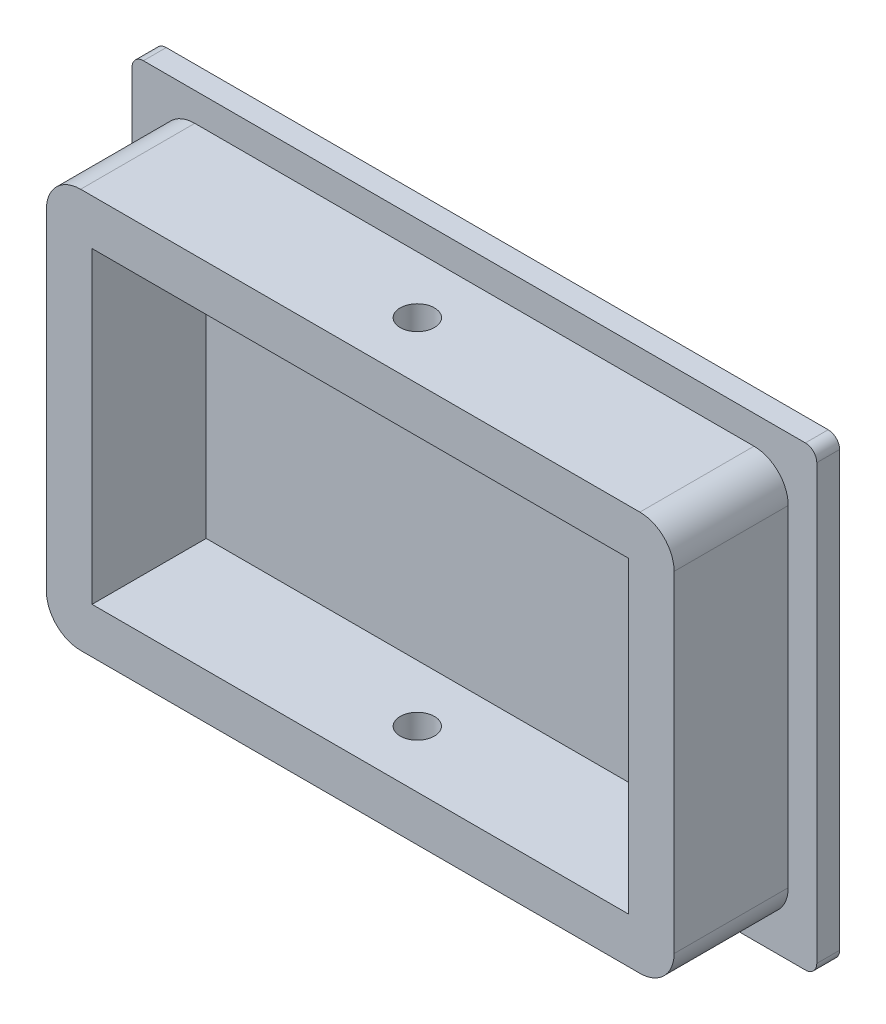
ISO-10303-21;
HEADER;
FILE_DESCRIPTION(('STEP AP214'),'2;1');
FILE_NAME('part.step','',(''),(''),'','','');
FILE_SCHEMA(('AUTOMOTIVE_DESIGN { 1 0 10303 214 1 1 1 1 }'));
ENDSEC;
DATA;
#1=APPLICATION_CONTEXT('core data for automotive mechanical design processes');
#2=APPLICATION_PROTOCOL_DEFINITION('international standard','automotive_design',2000,#1);
#3=PRODUCT_CONTEXT('',#1,'mechanical');
#4=PRODUCT('Part','Part','',(#3));
#5=PRODUCT_RELATED_PRODUCT_CATEGORY('part','',(#4));
#6=PRODUCT_DEFINITION_FORMATION('','',#4);
#7=PRODUCT_DEFINITION_CONTEXT('part definition',#1,'design');
#8=PRODUCT_DEFINITION('design','',#6,#7);
#9=PRODUCT_DEFINITION_SHAPE('','',#8);
#10=(LENGTH_UNIT() NAMED_UNIT(*) SI_UNIT(.MILLI.,.METRE.));
#11=(NAMED_UNIT(*) PLANE_ANGLE_UNIT() SI_UNIT($,.RADIAN.));
#12=(NAMED_UNIT(*) SI_UNIT($,.STERADIAN.) SOLID_ANGLE_UNIT());
#13=UNCERTAINTY_MEASURE_WITH_UNIT(LENGTH_MEASURE(1.E-05),#10,'distance_accuracy_value','');
#14=(GEOMETRIC_REPRESENTATION_CONTEXT(3) GLOBAL_UNCERTAINTY_ASSIGNED_CONTEXT((#13)) GLOBAL_UNIT_ASSIGNED_CONTEXT((#10,
#11,#12)) REPRESENTATION_CONTEXT('',''));
#15=CARTESIAN_POINT('',(0.,0.,0.));
#16=DIRECTION('',(0.,0.,1.));
#17=DIRECTION('',(1.,0.,0.));
#18=AXIS2_PLACEMENT_3D('',#15,#16,#17);
#19=CARTESIAN_POINT('',(0.,0.,2.));
#20=DIRECTION('',(0.,0.,-1.));
#21=DIRECTION('',(-1.,0.,0.));
#22=AXIS2_PLACEMENT_3D('',#19,#20,#21);
#23=PLANE('',#22);
#24=DIRECTION('',(0.,-1.,0.));
#25=VECTOR('',#24,1.);
#26=CARTESIAN_POINT('',(0.,0.,2.));
#27=LINE('',#26,#25);
#28=CARTESIAN_POINT('',(0.,39.,2.));
#29=VERTEX_POINT('',#28);
#30=CARTESIAN_POINT('',(0.,1.,2.));
#31=VERTEX_POINT('',#30);
#32=EDGE_CURVE('E259',#29,#31,#27,.T.);
#33=ORIENTED_EDGE('',*,*,#32,.T.);
#34=CARTESIAN_POINT('',(1.,1.,2.));
#35=DIRECTION('',(0.,0.,-1.));
#36=DIRECTION('',(-1.,0.,0.));
#37=AXIS2_PLACEMENT_3D('',#34,#35,#36);
#38=CIRCLE('',#37,1.);
#39=CARTESIAN_POINT('',(1.,0.,2.));
#40=VERTEX_POINT('',#39);
#41=EDGE_CURVE('E375',#31,#40,#38,.F.);
#42=ORIENTED_EDGE('',*,*,#41,.T.);
#43=DIRECTION('',(1.,0.,0.));
#44=VECTOR('',#43,1.);
#45=CARTESIAN_POINT('',(0.,0.,2.));
#46=LINE('',#45,#44);
#47=CARTESIAN_POINT('',(59.,0.,2.));
#48=VERTEX_POINT('',#47);
#49=EDGE_CURVE('E263',#40,#48,#46,.T.);
#50=ORIENTED_EDGE('',*,*,#49,.T.);
#51=CARTESIAN_POINT('',(59.,1.,2.));
#52=DIRECTION('',(0.,0.,-1.));
#53=DIRECTION('',(-1.,0.,0.));
#54=AXIS2_PLACEMENT_3D('',#51,#52,#53);
#55=CIRCLE('',#54,1.);
#56=CARTESIAN_POINT('',(60.,1.,2.));
#57=VERTEX_POINT('',#56);
#58=EDGE_CURVE('E372',#48,#57,#55,.F.);
#59=ORIENTED_EDGE('',*,*,#58,.T.);
#60=DIRECTION('',(0.,1.,0.));
#61=VECTOR('',#60,1.);
#62=CARTESIAN_POINT('',(60.,0.,2.));
#63=LINE('',#62,#61);
#64=CARTESIAN_POINT('',(60.,39.,2.));
#65=VERTEX_POINT('',#64);
#66=EDGE_CURVE('E268',#57,#65,#63,.T.);
#67=ORIENTED_EDGE('',*,*,#66,.T.);
#68=CARTESIAN_POINT('',(59.,39.,2.));
#69=DIRECTION('',(0.,0.,-1.));
#70=DIRECTION('',(-1.,0.,0.));
#71=AXIS2_PLACEMENT_3D('',#68,#69,#70);
#72=CIRCLE('',#71,1.);
#73=CARTESIAN_POINT('',(59.,40.,2.));
#74=VERTEX_POINT('',#73);
#75=EDGE_CURVE('E369',#65,#74,#72,.F.);
#76=ORIENTED_EDGE('',*,*,#75,.T.);
#77=DIRECTION('',(-1.,0.,0.));
#78=VECTOR('',#77,1.);
#79=CARTESIAN_POINT('',(0.,40.,2.));
#80=LINE('',#79,#78);
#81=CARTESIAN_POINT('',(1.,40.,2.));
#82=VERTEX_POINT('',#81);
#83=EDGE_CURVE('E272',#74,#82,#80,.T.);
#84=ORIENTED_EDGE('',*,*,#83,.T.);
#85=CARTESIAN_POINT('',(1.,39.,2.));
#86=DIRECTION('',(0.,0.,-1.));
#87=DIRECTION('',(-1.,0.,0.));
#88=AXIS2_PLACEMENT_3D('',#85,#86,#87);
#89=CIRCLE('',#88,1.);
#90=EDGE_CURVE('E366',#82,#29,#89,.F.);
#91=ORIENTED_EDGE('',*,*,#90,.T.);
#92=EDGE_LOOP('',(#33,#42,#50,#59,#67,#76,#84,#91));
#93=FACE_BOUND('',#92,.T.);
#94=DIRECTION('',(-1.,0.,0.));
#95=VECTOR('',#94,1.);
#96=CARTESIAN_POINT('',(57.5,37.5,2.));
#97=LINE('',#96,#95);
#98=CARTESIAN_POINT('',(54.5,37.5,2.));
#99=VERTEX_POINT('',#98);
#100=CARTESIAN_POINT('',(5.5,37.5,2.));
#101=VERTEX_POINT('',#100);
#102=EDGE_CURVE('E226',#99,#101,#97,.T.);
#103=ORIENTED_EDGE('',*,*,#102,.F.);
#104=CARTESIAN_POINT('',(54.5,34.5,2.));
#105=DIRECTION('',(0.,0.,-1.));
#106=DIRECTION('',(-1.,0.,0.));
#107=AXIS2_PLACEMENT_3D('',#104,#105,#106);
#108=CIRCLE('',#107,3.);
#109=CARTESIAN_POINT('',(57.5,34.5,2.));
#110=VERTEX_POINT('',#109);
#111=EDGE_CURVE('E337',#99,#110,#108,.T.);
#112=ORIENTED_EDGE('',*,*,#111,.T.);
#113=DIRECTION('',(0.,1.,0.));
#114=VECTOR('',#113,1.);
#115=CARTESIAN_POINT('',(57.5,2.5,2.));
#116=LINE('',#115,#114);
#117=CARTESIAN_POINT('',(57.5,5.5,2.));
#118=VERTEX_POINT('',#117);
#119=EDGE_CURVE('E232',#118,#110,#116,.T.);
#120=ORIENTED_EDGE('',*,*,#119,.F.);
#121=CARTESIAN_POINT('',(54.5,5.5,2.));
#122=DIRECTION('',(0.,0.,-1.));
#123=DIRECTION('',(-1.,0.,0.));
#124=AXIS2_PLACEMENT_3D('',#121,#122,#123);
#125=CIRCLE('',#124,3.);
#126=CARTESIAN_POINT('',(54.5,2.5,2.));
#127=VERTEX_POINT('',#126);
#128=EDGE_CURVE('E334',#118,#127,#125,.T.);
#129=ORIENTED_EDGE('',*,*,#128,.T.);
#130=DIRECTION('',(1.,0.,0.));
#131=VECTOR('',#130,1.);
#132=CARTESIAN_POINT('',(2.5,2.5,2.));
#133=LINE('',#132,#131);
#134=CARTESIAN_POINT('',(5.5,2.5,2.));
#135=VERTEX_POINT('',#134);
#136=EDGE_CURVE('E252',#135,#127,#133,.T.);
#137=ORIENTED_EDGE('',*,*,#136,.F.);
#138=CARTESIAN_POINT('',(5.5,5.5,2.));
#139=DIRECTION('',(0.,0.,-1.));
#140=DIRECTION('',(-1.,0.,0.));
#141=AXIS2_PLACEMENT_3D('',#138,#139,#140);
#142=CIRCLE('',#141,3.);
#143=CARTESIAN_POINT('',(2.5,5.5,2.));
#144=VERTEX_POINT('',#143);
#145=EDGE_CURVE('E331',#135,#144,#142,.T.);
#146=ORIENTED_EDGE('',*,*,#145,.T.);
#147=DIRECTION('',(0.,-1.,0.));
#148=VECTOR('',#147,1.);
#149=CARTESIAN_POINT('',(2.5,37.5,2.));
#150=LINE('',#149,#148);
#151=CARTESIAN_POINT('',(2.5,34.5,2.));
#152=VERTEX_POINT('',#151);
#153=EDGE_CURVE('E248',#152,#144,#150,.T.);
#154=ORIENTED_EDGE('',*,*,#153,.F.);
#155=CARTESIAN_POINT('',(5.5,34.5,2.));
#156=DIRECTION('',(0.,0.,-1.));
#157=DIRECTION('',(-1.,0.,0.));
#158=AXIS2_PLACEMENT_3D('',#155,#156,#157);
#159=CIRCLE('',#158,3.);
#160=EDGE_CURVE('E328',#152,#101,#159,.T.);
#161=ORIENTED_EDGE('',*,*,#160,.T.);
#162=EDGE_LOOP('',(#103,#112,#120,#129,#137,#146,#154,#161));
#163=FACE_BOUND('',#162,.T.);
#164=ADVANCED_FACE('F39',(#93,#163),#23,.F.);
#165=CARTESIAN_POINT('',(0.,0.,2.));
#166=DIRECTION('',(1.,0.,0.));
#167=DIRECTION('',(0.,0.,-1.));
#168=AXIS2_PLACEMENT_3D('',#165,#166,#167);
#169=PLANE('',#168);
#170=DIRECTION('',(0.,-1.,0.));
#171=VECTOR('',#170,1.);
#172=CARTESIAN_POINT('',(0.,0.,0.));
#173=LINE('',#172,#171);
#174=CARTESIAN_POINT('',(0.,39.,0.));
#175=VERTEX_POINT('',#174);
#176=CARTESIAN_POINT('',(0.,1.,0.));
#177=VERTEX_POINT('',#176);
#178=EDGE_CURVE('E244',#175,#177,#173,.T.);
#179=ORIENTED_EDGE('',*,*,#178,.T.);
#180=DIRECTION('',(0.,0.,-1.));
#181=VECTOR('',#180,1.);
#182=CARTESIAN_POINT('',(0.,1.,2.));
#183=LINE('',#182,#181);
#184=EDGE_CURVE('E363',#177,#31,#183,.F.);
#185=ORIENTED_EDGE('',*,*,#184,.T.);
#186=ORIENTED_EDGE('',*,*,#32,.F.);
#187=DIRECTION('',(0.,0.,-1.));
#188=VECTOR('',#187,1.);
#189=CARTESIAN_POINT('',(0.,39.,2.));
#190=LINE('',#189,#188);
#191=EDGE_CURVE('E359',#29,#175,#190,.T.);
#192=ORIENTED_EDGE('',*,*,#191,.T.);
#193=EDGE_LOOP('',(#179,#185,#186,#192));
#194=FACE_BOUND('',#193,.T.);
#195=ADVANCED_FACE('F411',(#194),#169,.F.);
#196=CARTESIAN_POINT('',(0.,0.,2.));
#197=DIRECTION('',(0.,1.,0.));
#198=DIRECTION('',(0.,0.,1.));
#199=AXIS2_PLACEMENT_3D('',#196,#197,#198);
#200=PLANE('',#199);
#201=ORIENTED_EDGE('',*,*,#49,.F.);
#202=DIRECTION('',(0.,0.,-1.));
#203=VECTOR('',#202,1.);
#204=CARTESIAN_POINT('',(1.,0.,2.));
#205=LINE('',#204,#203);
#206=CARTESIAN_POINT('',(1.,0.,0.));
#207=VERTEX_POINT('',#206);
#208=EDGE_CURVE('E343',#40,#207,#205,.T.);
#209=ORIENTED_EDGE('',*,*,#208,.T.);
#210=DIRECTION('',(1.,0.,0.));
#211=VECTOR('',#210,1.);
#212=CARTESIAN_POINT('',(0.,0.,0.));
#213=LINE('',#212,#211);
#214=CARTESIAN_POINT('',(59.,0.,0.));
#215=VERTEX_POINT('',#214);
#216=EDGE_CURVE('E279',#207,#215,#213,.T.);
#217=ORIENTED_EDGE('',*,*,#216,.T.);
#218=DIRECTION('',(0.,0.,-1.));
#219=VECTOR('',#218,1.);
#220=CARTESIAN_POINT('',(59.,0.,2.));
#221=LINE('',#220,#219);
#222=EDGE_CURVE('E340',#215,#48,#221,.F.);
#223=ORIENTED_EDGE('',*,*,#222,.T.);
#224=EDGE_LOOP('',(#201,#209,#217,#223));
#225=FACE_BOUND('',#224,.T.);
#226=ADVANCED_FACE('F419',(#225),#200,.F.);
#227=CARTESIAN_POINT('',(60.,0.,2.));
#228=DIRECTION('',(-1.,0.,0.));
#229=DIRECTION('',(0.,0.,1.));
#230=AXIS2_PLACEMENT_3D('',#227,#228,#229);
#231=PLANE('',#230);
#232=ORIENTED_EDGE('',*,*,#66,.F.);
#233=DIRECTION('',(0.,0.,-1.));
#234=VECTOR('',#233,1.);
#235=CARTESIAN_POINT('',(60.,1.,2.));
#236=LINE('',#235,#234);
#237=CARTESIAN_POINT('',(60.,1.,0.));
#238=VERTEX_POINT('',#237);
#239=EDGE_CURVE('E381',#57,#238,#236,.T.);
#240=ORIENTED_EDGE('',*,*,#239,.T.);
#241=DIRECTION('',(0.,1.,0.));
#242=VECTOR('',#241,1.);
#243=CARTESIAN_POINT('',(60.,0.,0.));
#244=LINE('',#243,#242);
#245=CARTESIAN_POINT('',(60.,39.,0.));
#246=VERTEX_POINT('',#245);
#247=EDGE_CURVE('E283',#238,#246,#244,.T.);
#248=ORIENTED_EDGE('',*,*,#247,.T.);
#249=DIRECTION('',(0.,0.,-1.));
#250=VECTOR('',#249,1.);
#251=CARTESIAN_POINT('',(60.,39.,2.));
#252=LINE('',#251,#250);
#253=EDGE_CURVE('E378',#246,#65,#252,.F.);
#254=ORIENTED_EDGE('',*,*,#253,.T.);
#255=EDGE_LOOP('',(#232,#240,#248,#254));
#256=FACE_BOUND('',#255,.T.);
#257=ADVANCED_FACE('F390',(#256),#231,.F.);
#258=CARTESIAN_POINT('',(0.,40.,2.));
#259=DIRECTION('',(0.,-1.,0.));
#260=DIRECTION('',(0.,0.,-1.));
#261=AXIS2_PLACEMENT_3D('',#258,#259,#260);
#262=PLANE('',#261);
#263=ORIENTED_EDGE('',*,*,#83,.F.);
#264=DIRECTION('',(0.,0.,-1.));
#265=VECTOR('',#264,1.);
#266=CARTESIAN_POINT('',(59.,40.,2.));
#267=LINE('',#266,#265);
#268=CARTESIAN_POINT('',(59.,40.,0.));
#269=VERTEX_POINT('',#268);
#270=EDGE_CURVE('E11',#74,#269,#267,.T.);
#271=ORIENTED_EDGE('',*,*,#270,.T.);
#272=DIRECTION('',(-1.,0.,0.));
#273=VECTOR('',#272,1.);
#274=CARTESIAN_POINT('',(0.,40.,0.));
#275=LINE('',#274,#273);
#276=CARTESIAN_POINT('',(1.,40.,0.));
#277=VERTEX_POINT('',#276);
#278=EDGE_CURVE('E264',#269,#277,#275,.T.);
#279=ORIENTED_EDGE('',*,*,#278,.T.);
#280=DIRECTION('',(0.,0.,-1.));
#281=VECTOR('',#280,1.);
#282=CARTESIAN_POINT('',(1.,40.,2.));
#283=LINE('',#282,#281);
#284=EDGE_CURVE('E49',#277,#82,#283,.F.);
#285=ORIENTED_EDGE('',*,*,#284,.T.);
#286=EDGE_LOOP('',(#263,#271,#279,#285));
#287=FACE_BOUND('',#286,.T.);
#288=ADVANCED_FACE('F402',(#287),#262,.F.);
#289=CARTESIAN_POINT('',(0.,0.,0.));
#290=DIRECTION('',(0.,0.,-1.));
#291=DIRECTION('',(-1.,0.,0.));
#292=AXIS2_PLACEMENT_3D('',#289,#290,#291);
#293=PLANE('',#292);
#294=ORIENTED_EDGE('',*,*,#216,.F.);
#295=CARTESIAN_POINT('',(1.,1.,0.));
#296=DIRECTION('',(0.,0.,-1.));
#297=DIRECTION('',(-1.,0.,0.));
#298=AXIS2_PLACEMENT_3D('',#295,#296,#297);
#299=CIRCLE('',#298,1.);
#300=EDGE_CURVE('E356',#207,#177,#299,.T.);
#301=ORIENTED_EDGE('',*,*,#300,.T.);
#302=ORIENTED_EDGE('',*,*,#178,.F.);
#303=CARTESIAN_POINT('',(1.,39.,0.));
#304=DIRECTION('',(0.,0.,-1.));
#305=DIRECTION('',(-1.,0.,0.));
#306=AXIS2_PLACEMENT_3D('',#303,#304,#305);
#307=CIRCLE('',#306,1.);
#308=EDGE_CURVE('E347',#175,#277,#307,.T.);
#309=ORIENTED_EDGE('',*,*,#308,.T.);
#310=ORIENTED_EDGE('',*,*,#278,.F.);
#311=CARTESIAN_POINT('',(59.,39.,0.));
#312=DIRECTION('',(0.,0.,-1.));
#313=DIRECTION('',(-1.,0.,0.));
#314=AXIS2_PLACEMENT_3D('',#311,#312,#313);
#315=CIRCLE('',#314,1.);
#316=EDGE_CURVE('E350',#269,#246,#315,.T.);
#317=ORIENTED_EDGE('',*,*,#316,.T.);
#318=ORIENTED_EDGE('',*,*,#247,.F.);
#319=CARTESIAN_POINT('',(59.,1.,0.));
#320=DIRECTION('',(0.,0.,-1.));
#321=DIRECTION('',(-1.,0.,0.));
#322=AXIS2_PLACEMENT_3D('',#319,#320,#321);
#323=CIRCLE('',#322,1.);
#324=EDGE_CURVE('E353',#238,#215,#323,.T.);
#325=ORIENTED_EDGE('',*,*,#324,.T.);
#326=EDGE_LOOP('',(#294,#301,#302,#309,#310,#317,#318,#325));
#327=FACE_BOUND('',#326,.T.);
#328=ADVANCED_FACE('F396',(#327),#293,.T.);
#329=CARTESIAN_POINT('',(57.5,37.5,12.));
#330=DIRECTION('',(0.,-1.,0.));
#331=DIRECTION('',(0.,0.,-1.));
#332=AXIS2_PLACEMENT_3D('',#329,#330,#331);
#333=PLANE('',#332);
#334=CARTESIAN_POINT('',(30.,37.5,7.00000000000001));
#335=DIRECTION('',(0.,1.,0.));
#336=DIRECTION('',(0.,0.,1.));
#337=AXIS2_PLACEMENT_3D('',#334,#335,#336);
#338=CIRCLE('',#337,1.5);
#339=CARTESIAN_POINT('',(30.,37.5,8.50000000000001));
#340=VERTEX_POINT('',#339);
#341=EDGE_CURVE('E513',#340,#340,#338,.T.);
#342=ORIENTED_EDGE('',*,*,#341,.F.);
#343=EDGE_LOOP('',(#342));
#344=FACE_BOUND('',#343,.T.);
#345=ORIENTED_EDGE('',*,*,#102,.T.);
#346=DIRECTION('',(0.,0.,-1.));
#347=VECTOR('',#346,1.);
#348=CARTESIAN_POINT('',(5.5,37.5,12.));
#349=LINE('',#348,#347);
#350=CARTESIAN_POINT('',(5.5,37.5,12.));
#351=VERTEX_POINT('',#350);
#352=EDGE_CURVE('E299',#101,#351,#349,.F.);
#353=ORIENTED_EDGE('',*,*,#352,.T.);
#354=DIRECTION('',(-1.,0.,0.));
#355=VECTOR('',#354,1.);
#356=CARTESIAN_POINT('',(57.5,37.5,12.));
#357=LINE('',#356,#355);
#358=CARTESIAN_POINT('',(54.5,37.5,12.));
#359=VERTEX_POINT('',#358);
#360=EDGE_CURVE('E227',#359,#351,#357,.T.);
#361=ORIENTED_EDGE('',*,*,#360,.F.);
#362=DIRECTION('',(0.,0.,-1.));
#363=VECTOR('',#362,1.);
#364=CARTESIAN_POINT('',(54.5,37.5,12.));
#365=LINE('',#364,#363);
#366=EDGE_CURVE('E295',#359,#99,#365,.T.);
#367=ORIENTED_EDGE('',*,*,#366,.T.);
#368=EDGE_LOOP('',(#345,#353,#361,#367));
#369=FACE_BOUND('',#368,.T.);
#370=ADVANCED_FACE('F438',(#344,#369),#333,.F.);
#371=CARTESIAN_POINT('',(2.5,37.5,12.));
#372=DIRECTION('',(1.,0.,0.));
#373=DIRECTION('',(0.,0.,-1.));
#374=AXIS2_PLACEMENT_3D('',#371,#372,#373);
#375=PLANE('',#374);
#376=DIRECTION('',(0.,-1.,0.));
#377=VECTOR('',#376,1.);
#378=CARTESIAN_POINT('',(2.5,37.5,12.));
#379=LINE('',#378,#377);
#380=CARTESIAN_POINT('',(2.5,34.5,12.));
#381=VERTEX_POINT('',#380);
#382=CARTESIAN_POINT('',(2.5,5.5,12.));
#383=VERTEX_POINT('',#382);
#384=EDGE_CURVE('E231',#381,#383,#379,.T.);
#385=ORIENTED_EDGE('',*,*,#384,.F.);
#386=DIRECTION('',(0.,0.,-1.));
#387=VECTOR('',#386,1.);
#388=CARTESIAN_POINT('',(2.5,34.5,12.));
#389=LINE('',#388,#387);
#390=EDGE_CURVE('E291',#381,#152,#389,.T.);
#391=ORIENTED_EDGE('',*,*,#390,.T.);
#392=ORIENTED_EDGE('',*,*,#153,.T.);
#393=DIRECTION('',(0.,0.,-1.));
#394=VECTOR('',#393,1.);
#395=CARTESIAN_POINT('',(2.5,5.5,12.));
#396=LINE('',#395,#394);
#397=EDGE_CURVE('E275',#144,#383,#396,.F.);
#398=ORIENTED_EDGE('',*,*,#397,.T.);
#399=EDGE_LOOP('',(#385,#391,#392,#398));
#400=FACE_BOUND('',#399,.T.);
#401=ADVANCED_FACE('F479',(#400),#375,.F.);
#402=CARTESIAN_POINT('',(2.5,2.5,12.));
#403=DIRECTION('',(0.,1.,0.));
#404=DIRECTION('',(0.,0.,1.));
#405=AXIS2_PLACEMENT_3D('',#402,#403,#404);
#406=PLANE('',#405);
#407=CARTESIAN_POINT('',(30.,2.5,7.00000000000001));
#408=DIRECTION('',(0.,1.,0.));
#409=DIRECTION('',(0.,0.,1.));
#410=AXIS2_PLACEMENT_3D('',#407,#408,#409);
#411=CIRCLE('',#410,1.5);
#412=CARTESIAN_POINT('',(30.,2.5,8.50000000000001));
#413=VERTEX_POINT('',#412);
#414=EDGE_CURVE('E524',#413,#413,#411,.T.);
#415=ORIENTED_EDGE('',*,*,#414,.T.);
#416=EDGE_LOOP('',(#415));
#417=FACE_BOUND('',#416,.T.);
#418=DIRECTION('',(1.,0.,0.));
#419=VECTOR('',#418,1.);
#420=CARTESIAN_POINT('',(2.5,2.5,12.));
#421=LINE('',#420,#419);
#422=CARTESIAN_POINT('',(5.5,2.5,12.));
#423=VERTEX_POINT('',#422);
#424=CARTESIAN_POINT('',(54.5,2.5,12.));
#425=VERTEX_POINT('',#424);
#426=EDGE_CURVE('E236',#423,#425,#421,.T.);
#427=ORIENTED_EDGE('',*,*,#426,.F.);
#428=DIRECTION('',(0.,0.,-1.));
#429=VECTOR('',#428,1.);
#430=CARTESIAN_POINT('',(5.5,2.5,12.));
#431=LINE('',#430,#429);
#432=EDGE_CURVE('E317',#423,#135,#431,.T.);
#433=ORIENTED_EDGE('',*,*,#432,.T.);
#434=ORIENTED_EDGE('',*,*,#136,.T.);
#435=DIRECTION('',(0.,0.,-1.));
#436=VECTOR('',#435,1.);
#437=CARTESIAN_POINT('',(54.5,2.5,12.));
#438=LINE('',#437,#436);
#439=EDGE_CURVE('E314',#127,#425,#438,.F.);
#440=ORIENTED_EDGE('',*,*,#439,.T.);
#441=EDGE_LOOP('',(#427,#433,#434,#440));
#442=FACE_BOUND('',#441,.T.);
#443=ADVANCED_FACE('F486',(#417,#442),#406,.F.);
#444=CARTESIAN_POINT('',(57.5,2.5,12.));
#445=DIRECTION('',(-1.,0.,0.));
#446=DIRECTION('',(0.,0.,1.));
#447=AXIS2_PLACEMENT_3D('',#444,#445,#446);
#448=PLANE('',#447);
#449=DIRECTION('',(0.,1.,0.));
#450=VECTOR('',#449,1.);
#451=CARTESIAN_POINT('',(57.5,2.5,12.));
#452=LINE('',#451,#450);
#453=CARTESIAN_POINT('',(57.5,5.5,12.));
#454=VERTEX_POINT('',#453);
#455=CARTESIAN_POINT('',(57.5,34.5,12.));
#456=VERTEX_POINT('',#455);
#457=EDGE_CURVE('E240',#454,#456,#452,.T.);
#458=ORIENTED_EDGE('',*,*,#457,.F.);
#459=DIRECTION('',(0.,0.,-1.));
#460=VECTOR('',#459,1.);
#461=CARTESIAN_POINT('',(57.5,5.5,12.));
#462=LINE('',#461,#460);
#463=EDGE_CURVE('E324',#454,#118,#462,.T.);
#464=ORIENTED_EDGE('',*,*,#463,.T.);
#465=ORIENTED_EDGE('',*,*,#119,.T.);
#466=DIRECTION('',(0.,0.,-1.));
#467=VECTOR('',#466,1.);
#468=CARTESIAN_POINT('',(57.5,34.5,12.));
#469=LINE('',#468,#467);
#470=EDGE_CURVE('E321',#110,#456,#469,.F.);
#471=ORIENTED_EDGE('',*,*,#470,.T.);
#472=EDGE_LOOP('',(#458,#464,#465,#471));
#473=FACE_BOUND('',#472,.T.);
#474=ADVANCED_FACE('F491',(#473),#448,.F.);
#475=CARTESIAN_POINT('',(0.,0.,12.));
#476=DIRECTION('',(0.,0.,1.));
#477=DIRECTION('',(1.,0.,0.));
#478=AXIS2_PLACEMENT_3D('',#475,#476,#477);
#479=PLANE('',#478);
#480=DIRECTION('',(-1.,0.,0.));
#481=VECTOR('',#480,1.);
#482=CARTESIAN_POINT('',(53.5,33.5,12.));
#483=LINE('',#482,#481);
#484=CARTESIAN_POINT('',(53.5,33.5,12.));
#485=VERTEX_POINT('',#484);
#486=CARTESIAN_POINT('',(6.5,33.5,12.));
#487=VERTEX_POINT('',#486);
#488=EDGE_CURVE('E197',#485,#487,#483,.T.);
#489=ORIENTED_EDGE('',*,*,#488,.F.);
#490=DIRECTION('',(0.,1.,0.));
#491=VECTOR('',#490,1.);
#492=CARTESIAN_POINT('',(53.5,6.5,12.));
#493=LINE('',#492,#491);
#494=CARTESIAN_POINT('',(53.5,6.5,12.));
#495=VERTEX_POINT('',#494);
#496=EDGE_CURVE('E211',#495,#485,#493,.T.);
#497=ORIENTED_EDGE('',*,*,#496,.F.);
#498=DIRECTION('',(1.,0.,0.));
#499=VECTOR('',#498,1.);
#500=CARTESIAN_POINT('',(6.5,6.5,12.));
#501=LINE('',#500,#499);
#502=CARTESIAN_POINT('',(6.5,6.5,12.));
#503=VERTEX_POINT('',#502);
#504=EDGE_CURVE('E56',#503,#495,#501,.T.);
#505=ORIENTED_EDGE('',*,*,#504,.F.);
#506=DIRECTION('',(0.,-1.,0.));
#507=VECTOR('',#506,1.);
#508=CARTESIAN_POINT('',(6.5,33.5,12.));
#509=LINE('',#508,#507);
#510=EDGE_CURVE('E207',#487,#503,#509,.T.);
#511=ORIENTED_EDGE('',*,*,#510,.F.);
#512=EDGE_LOOP('',(#489,#497,#505,#511));
#513=FACE_BOUND('',#512,.T.);
#514=ORIENTED_EDGE('',*,*,#360,.T.);
#515=CARTESIAN_POINT('',(5.5,34.5,12.));
#516=DIRECTION('',(0.,0.,1.));
#517=DIRECTION('',(1.,0.,0.));
#518=AXIS2_PLACEMENT_3D('',#515,#516,#517);
#519=CIRCLE('',#518,3.);
#520=EDGE_CURVE('E311',#351,#381,#519,.T.);
#521=ORIENTED_EDGE('',*,*,#520,.T.);
#522=ORIENTED_EDGE('',*,*,#384,.T.);
#523=CARTESIAN_POINT('',(5.5,5.5,12.));
#524=DIRECTION('',(0.,0.,1.));
#525=DIRECTION('',(1.,0.,0.));
#526=AXIS2_PLACEMENT_3D('',#523,#524,#525);
#527=CIRCLE('',#526,3.);
#528=EDGE_CURVE('E308',#383,#423,#527,.T.);
#529=ORIENTED_EDGE('',*,*,#528,.T.);
#530=ORIENTED_EDGE('',*,*,#426,.T.);
#531=CARTESIAN_POINT('',(54.5,5.5,12.));
#532=DIRECTION('',(0.,0.,1.));
#533=DIRECTION('',(1.,0.,0.));
#534=AXIS2_PLACEMENT_3D('',#531,#532,#533);
#535=CIRCLE('',#534,3.);
#536=EDGE_CURVE('E305',#425,#454,#535,.T.);
#537=ORIENTED_EDGE('',*,*,#536,.T.);
#538=ORIENTED_EDGE('',*,*,#457,.T.);
#539=CARTESIAN_POINT('',(54.5,34.5,12.));
#540=DIRECTION('',(0.,0.,1.));
#541=DIRECTION('',(1.,0.,0.));
#542=AXIS2_PLACEMENT_3D('',#539,#540,#541);
#543=CIRCLE('',#542,3.);
#544=EDGE_CURVE('E302',#456,#359,#543,.T.);
#545=ORIENTED_EDGE('',*,*,#544,.T.);
#546=EDGE_LOOP('',(#514,#521,#522,#529,#530,#537,#538,#545));
#547=FACE_BOUND('',#546,.T.);
#548=ADVANCED_FACE('F452',(#513,#547),#479,.T.);
#549=CARTESIAN_POINT('',(5.5,34.5,12.));
#550=DIRECTION('',(0.,0.,-1.));
#551=DIRECTION('',(-1.,0.,0.));
#552=AXIS2_PLACEMENT_3D('',#549,#550,#551);
#553=CYLINDRICAL_SURFACE('',#552,3.);
#554=ORIENTED_EDGE('',*,*,#520,.F.);
#555=ORIENTED_EDGE('',*,*,#352,.F.);
#556=ORIENTED_EDGE('',*,*,#160,.F.);
#557=ORIENTED_EDGE('',*,*,#390,.F.);
#558=EDGE_LOOP('',(#554,#555,#556,#557));
#559=FACE_BOUND('',#558,.T.);
#560=ADVANCED_FACE('F448',(#559),#553,.T.);
#561=CARTESIAN_POINT('',(5.5,5.5,12.));
#562=DIRECTION('',(0.,0.,-1.));
#563=DIRECTION('',(-1.,0.,0.));
#564=AXIS2_PLACEMENT_3D('',#561,#562,#563);
#565=CYLINDRICAL_SURFACE('',#564,3.);
#566=ORIENTED_EDGE('',*,*,#528,.F.);
#567=ORIENTED_EDGE('',*,*,#397,.F.);
#568=ORIENTED_EDGE('',*,*,#145,.F.);
#569=ORIENTED_EDGE('',*,*,#432,.F.);
#570=EDGE_LOOP('',(#566,#567,#568,#569));
#571=FACE_BOUND('',#570,.T.);
#572=ADVANCED_FACE('F451',(#571),#565,.T.);
#573=CARTESIAN_POINT('',(54.5,5.5,12.));
#574=DIRECTION('',(0.,0.,-1.));
#575=DIRECTION('',(-1.,0.,0.));
#576=AXIS2_PLACEMENT_3D('',#573,#574,#575);
#577=CYLINDRICAL_SURFACE('',#576,3.);
#578=ORIENTED_EDGE('',*,*,#536,.F.);
#579=ORIENTED_EDGE('',*,*,#439,.F.);
#580=ORIENTED_EDGE('',*,*,#128,.F.);
#581=ORIENTED_EDGE('',*,*,#463,.F.);
#582=EDGE_LOOP('',(#578,#579,#580,#581));
#583=FACE_BOUND('',#582,.T.);
#584=ADVANCED_FACE('F456',(#583),#577,.T.);
#585=CARTESIAN_POINT('',(54.5,34.5,12.));
#586=DIRECTION('',(0.,0.,-1.));
#587=DIRECTION('',(-1.,0.,0.));
#588=AXIS2_PLACEMENT_3D('',#585,#586,#587);
#589=CYLINDRICAL_SURFACE('',#588,3.);
#590=ORIENTED_EDGE('',*,*,#544,.F.);
#591=ORIENTED_EDGE('',*,*,#470,.F.);
#592=ORIENTED_EDGE('',*,*,#111,.F.);
#593=ORIENTED_EDGE('',*,*,#366,.F.);
#594=EDGE_LOOP('',(#590,#591,#592,#593));
#595=FACE_BOUND('',#594,.T.);
#596=ADVANCED_FACE('F428',(#595),#589,.T.);
#597=CARTESIAN_POINT('',(1.,1.,2.));
#598=DIRECTION('',(0.,0.,-1.));
#599=DIRECTION('',(-1.,0.,0.));
#600=AXIS2_PLACEMENT_3D('',#597,#598,#599);
#601=CYLINDRICAL_SURFACE('',#600,1.);
#602=ORIENTED_EDGE('',*,*,#41,.F.);
#603=ORIENTED_EDGE('',*,*,#184,.F.);
#604=ORIENTED_EDGE('',*,*,#300,.F.);
#605=ORIENTED_EDGE('',*,*,#208,.F.);
#606=EDGE_LOOP('',(#602,#603,#604,#605));
#607=FACE_BOUND('',#606,.T.);
#608=ADVANCED_FACE('F416',(#607),#601,.T.);
#609=CARTESIAN_POINT('',(59.,1.,2.));
#610=DIRECTION('',(0.,0.,-1.));
#611=DIRECTION('',(-1.,0.,0.));
#612=AXIS2_PLACEMENT_3D('',#609,#610,#611);
#613=CYLINDRICAL_SURFACE('',#612,1.);
#614=ORIENTED_EDGE('',*,*,#58,.F.);
#615=ORIENTED_EDGE('',*,*,#222,.F.);
#616=ORIENTED_EDGE('',*,*,#324,.F.);
#617=ORIENTED_EDGE('',*,*,#239,.F.);
#618=EDGE_LOOP('',(#614,#615,#616,#617));
#619=FACE_BOUND('',#618,.T.);
#620=ADVANCED_FACE('F421',(#619),#613,.T.);
#621=CARTESIAN_POINT('',(59.,39.,2.));
#622=DIRECTION('',(0.,0.,-1.));
#623=DIRECTION('',(-1.,0.,0.));
#624=AXIS2_PLACEMENT_3D('',#621,#622,#623);
#625=CYLINDRICAL_SURFACE('',#624,1.);
#626=ORIENTED_EDGE('',*,*,#75,.F.);
#627=ORIENTED_EDGE('',*,*,#253,.F.);
#628=ORIENTED_EDGE('',*,*,#316,.F.);
#629=ORIENTED_EDGE('',*,*,#270,.F.);
#630=EDGE_LOOP('',(#626,#627,#628,#629));
#631=FACE_BOUND('',#630,.T.);
#632=ADVANCED_FACE('F401',(#631),#625,.T.);
#633=CARTESIAN_POINT('',(1.,39.,2.));
#634=DIRECTION('',(0.,0.,-1.));
#635=DIRECTION('',(-1.,0.,0.));
#636=AXIS2_PLACEMENT_3D('',#633,#634,#635);
#637=CYLINDRICAL_SURFACE('',#636,1.);
#638=ORIENTED_EDGE('',*,*,#90,.F.);
#639=ORIENTED_EDGE('',*,*,#284,.F.);
#640=ORIENTED_EDGE('',*,*,#308,.F.);
#641=ORIENTED_EDGE('',*,*,#191,.F.);
#642=EDGE_LOOP('',(#638,#639,#640,#641));
#643=FACE_BOUND('',#642,.T.);
#644=ADVANCED_FACE('F41',(#643),#637,.T.);
#645=CARTESIAN_POINT('',(0.,0.,2.));
#646=DIRECTION('',(0.,0.,-1.));
#647=DIRECTION('',(-1.,0.,0.));
#648=AXIS2_PLACEMENT_3D('',#645,#646,#647);
#649=PLANE('',#648);
#650=DIRECTION('',(0.,1.,0.));
#651=VECTOR('',#650,1.);
#652=CARTESIAN_POINT('',(53.5,6.5,2.));
#653=LINE('',#652,#651);
#654=CARTESIAN_POINT('',(53.5,6.5,2.));
#655=VERTEX_POINT('',#654);
#656=CARTESIAN_POINT('',(53.5,33.5,2.));
#657=VERTEX_POINT('',#656);
#658=EDGE_CURVE('E202',#655,#657,#653,.T.);
#659=ORIENTED_EDGE('',*,*,#658,.T.);
#660=DIRECTION('',(-1.,0.,0.));
#661=VECTOR('',#660,1.);
#662=CARTESIAN_POINT('',(53.5,33.5,2.));
#663=LINE('',#662,#661);
#664=CARTESIAN_POINT('',(6.5,33.5,2.));
#665=VERTEX_POINT('',#664);
#666=EDGE_CURVE('E194',#657,#665,#663,.T.);
#667=ORIENTED_EDGE('',*,*,#666,.T.);
#668=DIRECTION('',(0.,-1.,0.));
#669=VECTOR('',#668,1.);
#670=CARTESIAN_POINT('',(6.5,33.5,2.));
#671=LINE('',#670,#669);
#672=CARTESIAN_POINT('',(6.5,6.5,2.));
#673=VERTEX_POINT('',#672);
#674=EDGE_CURVE('E180',#665,#673,#671,.T.);
#675=ORIENTED_EDGE('',*,*,#674,.T.);
#676=DIRECTION('',(1.,0.,0.));
#677=VECTOR('',#676,1.);
#678=CARTESIAN_POINT('',(6.5,6.5,2.));
#679=LINE('',#678,#677);
#680=EDGE_CURVE('E217',#673,#655,#679,.T.);
#681=ORIENTED_EDGE('',*,*,#680,.T.);
#682=EDGE_LOOP('',(#659,#667,#675,#681));
#683=FACE_BOUND('',#682,.T.);
#684=ADVANCED_FACE('F201',(#683),#649,.F.);
#685=CARTESIAN_POINT('',(53.5,33.5,-52.2033209314706));
#686=DIRECTION('',(0.,1.,0.));
#687=DIRECTION('',(0.,0.,1.));
#688=AXIS2_PLACEMENT_3D('',#685,#686,#687);
#689=PLANE('',#688);
#690=CARTESIAN_POINT('',(30.,33.5,7.00000000000001));
#691=DIRECTION('',(0.,1.,0.));
#692=DIRECTION('',(0.,0.,1.));
#693=AXIS2_PLACEMENT_3D('',#690,#691,#692);
#694=CIRCLE('',#693,1.5);
#695=CARTESIAN_POINT('',(30.,33.5,8.50000000000001));
#696=VERTEX_POINT('',#695);
#697=EDGE_CURVE('E519',#696,#696,#694,.T.);
#698=ORIENTED_EDGE('',*,*,#697,.T.);
#699=EDGE_LOOP('',(#698));
#700=FACE_BOUND('',#699,.T.);
#701=DIRECTION('',(0.,0.,1.));
#702=VECTOR('',#701,1.);
#703=CARTESIAN_POINT('',(53.5,33.5,-52.2033209314706));
#704=LINE('',#703,#702);
#705=EDGE_CURVE('E215',#657,#485,#704,.T.);
#706=ORIENTED_EDGE('',*,*,#705,.T.);
#707=ORIENTED_EDGE('',*,*,#488,.T.);
#708=DIRECTION('',(0.,0.,1.));
#709=VECTOR('',#708,1.);
#710=CARTESIAN_POINT('',(6.5,33.5,-52.2033209314706));
#711=LINE('',#710,#709);
#712=EDGE_CURVE('E184',#665,#487,#711,.T.);
#713=ORIENTED_EDGE('',*,*,#712,.F.);
#714=ORIENTED_EDGE('',*,*,#666,.F.);
#715=EDGE_LOOP('',(#706,#707,#713,#714));
#716=FACE_BOUND('',#715,.T.);
#717=ADVANCED_FACE('F193',(#700,#716),#689,.F.);
#718=CARTESIAN_POINT('',(6.5,33.5,-52.2033209314706));
#719=DIRECTION('',(-1.,0.,0.));
#720=DIRECTION('',(0.,0.,1.));
#721=AXIS2_PLACEMENT_3D('',#718,#719,#720);
#722=PLANE('',#721);
#723=ORIENTED_EDGE('',*,*,#712,.T.);
#724=ORIENTED_EDGE('',*,*,#510,.T.);
#725=DIRECTION('',(0.,0.,1.));
#726=VECTOR('',#725,1.);
#727=CARTESIAN_POINT('',(6.5,6.5,-52.2033209314706));
#728=LINE('',#727,#726);
#729=EDGE_CURVE('E186',#673,#503,#728,.T.);
#730=ORIENTED_EDGE('',*,*,#729,.F.);
#731=ORIENTED_EDGE('',*,*,#674,.F.);
#732=EDGE_LOOP('',(#723,#724,#730,#731));
#733=FACE_BOUND('',#732,.T.);
#734=ADVANCED_FACE('F182',(#733),#722,.F.);
#735=CARTESIAN_POINT('',(6.5,6.5,-52.2033209314706));
#736=DIRECTION('',(0.,-1.,0.));
#737=DIRECTION('',(0.,0.,-1.));
#738=AXIS2_PLACEMENT_3D('',#735,#736,#737);
#739=PLANE('',#738);
#740=CARTESIAN_POINT('',(30.,6.5,7.00000000000001));
#741=DIRECTION('',(0.,-1.,0.));
#742=DIRECTION('',(0.,0.,-1.));
#743=AXIS2_PLACEMENT_3D('',#740,#741,#742);
#744=CIRCLE('',#743,1.5);
#745=CARTESIAN_POINT('',(30.,6.5,5.5));
#746=VERTEX_POINT('',#745);
#747=EDGE_CURVE('E43',#746,#746,#744,.T.);
#748=ORIENTED_EDGE('',*,*,#747,.T.);
#749=EDGE_LOOP('',(#748));
#750=FACE_BOUND('',#749,.T.);
#751=ORIENTED_EDGE('',*,*,#729,.T.);
#752=ORIENTED_EDGE('',*,*,#504,.T.);
#753=DIRECTION('',(0.,0.,1.));
#754=VECTOR('',#753,1.);
#755=CARTESIAN_POINT('',(53.5,6.5,-52.2033209314706));
#756=LINE('',#755,#754);
#757=EDGE_CURVE('E216',#655,#495,#756,.T.);
#758=ORIENTED_EDGE('',*,*,#757,.F.);
#759=ORIENTED_EDGE('',*,*,#680,.F.);
#760=EDGE_LOOP('',(#751,#752,#758,#759));
#761=FACE_BOUND('',#760,.T.);
#762=ADVANCED_FACE('F535',(#750,#761),#739,.F.);
#763=CARTESIAN_POINT('',(53.5,6.5,-52.2033209314706));
#764=DIRECTION('',(1.,0.,0.));
#765=DIRECTION('',(0.,0.,-1.));
#766=AXIS2_PLACEMENT_3D('',#763,#764,#765);
#767=PLANE('',#766);
#768=ORIENTED_EDGE('',*,*,#757,.T.);
#769=ORIENTED_EDGE('',*,*,#496,.T.);
#770=ORIENTED_EDGE('',*,*,#705,.F.);
#771=ORIENTED_EDGE('',*,*,#658,.F.);
#772=EDGE_LOOP('',(#768,#769,#770,#771));
#773=FACE_BOUND('',#772,.T.);
#774=ADVANCED_FACE('F534',(#773),#767,.F.);
#775=CARTESIAN_POINT('',(30.,0.,7.00000000000001));
#776=DIRECTION('',(0.,1.,0.));
#777=DIRECTION('',(0.,0.,1.));
#778=AXIS2_PLACEMENT_3D('',#775,#776,#777);
#779=CYLINDRICAL_SURFACE('',#778,1.5);
#780=ORIENTED_EDGE('',*,*,#747,.F.);
#781=EDGE_LOOP('',(#780));
#782=FACE_BOUND('',#781,.T.);
#783=ORIENTED_EDGE('',*,*,#414,.F.);
#784=EDGE_LOOP('',(#783));
#785=FACE_BOUND('',#784,.T.);
#786=ADVANCED_FACE('F543',(#782,#785),#779,.F.);
#787=ORIENTED_EDGE('',*,*,#341,.T.);
#788=EDGE_LOOP('',(#787));
#789=FACE_BOUND('',#788,.T.);
#790=ORIENTED_EDGE('',*,*,#697,.F.);
#791=EDGE_LOOP('',(#790));
#792=FACE_BOUND('',#791,.T.);
#793=ADVANCED_FACE('F669',(#789,#792),#779,.F.);
#794=CLOSED_SHELL('',(#164,#195,#226,#257,#288,#328,#370,#401,#443,#474,#548,#560,#572,#584,
#596,#608,#620,#632,#644,#684,#717,#734,#762,#774,#786,#793));
#795=MANIFOLD_SOLID_BREP('B2',#794);
#796=ADVANCED_BREP_SHAPE_REPRESENTATION('',(#18,#795),#14);
#797=SHAPE_DEFINITION_REPRESENTATION(#9,#796);
ENDSEC;
END-ISO-10303-21;
